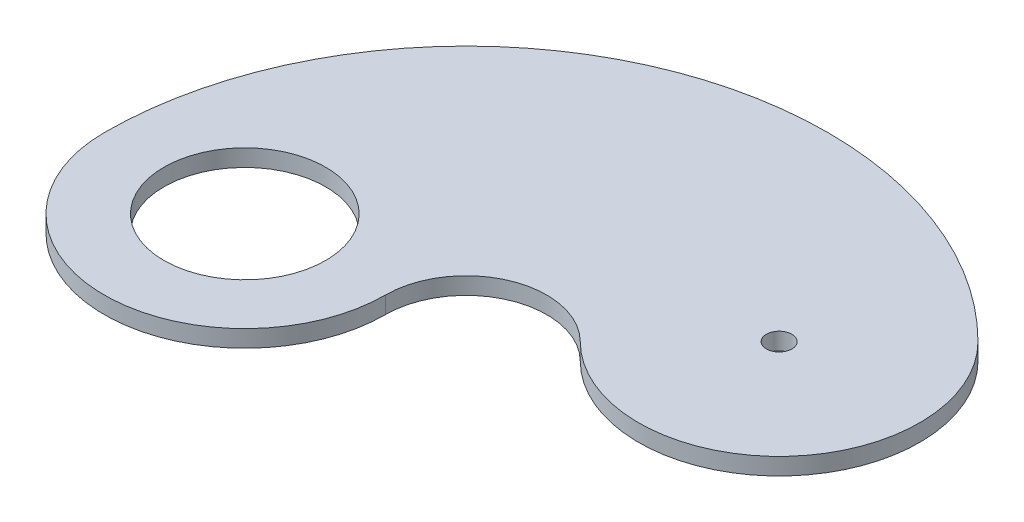
ISO-10303-21;
HEADER;
FILE_DESCRIPTION(('STEP AP214'),'2;1');
FILE_NAME('part.step','',(''),(''),'','','');
FILE_SCHEMA(('AUTOMOTIVE_DESIGN { 1 0 10303 214 1 1 1 1 }'));
ENDSEC;
DATA;
#1=APPLICATION_CONTEXT('core data for automotive mechanical design processes');
#2=APPLICATION_PROTOCOL_DEFINITION('international standard','automotive_design',2000,#1);
#3=PRODUCT_CONTEXT('',#1,'mechanical');
#4=PRODUCT('Part','Part','',(#3));
#5=PRODUCT_RELATED_PRODUCT_CATEGORY('part','',(#4));
#6=PRODUCT_DEFINITION_FORMATION('','',#4);
#7=PRODUCT_DEFINITION_CONTEXT('part definition',#1,'design');
#8=PRODUCT_DEFINITION('design','',#6,#7);
#9=PRODUCT_DEFINITION_SHAPE('','',#8);
#10=(LENGTH_UNIT() NAMED_UNIT(*) SI_UNIT(.MILLI.,.METRE.));
#11=(NAMED_UNIT(*) PLANE_ANGLE_UNIT() SI_UNIT($,.RADIAN.));
#12=(NAMED_UNIT(*) SI_UNIT($,.STERADIAN.) SOLID_ANGLE_UNIT());
#13=UNCERTAINTY_MEASURE_WITH_UNIT(LENGTH_MEASURE(1.E-05),#10,'distance_accuracy_value','');
#14=(GEOMETRIC_REPRESENTATION_CONTEXT(3) GLOBAL_UNCERTAINTY_ASSIGNED_CONTEXT((#13)) GLOBAL_UNIT_ASSIGNED_CONTEXT((#10,
#11,#12)) REPRESENTATION_CONTEXT('',''));
#15=CARTESIAN_POINT('',(0.,0.,0.));
#16=DIRECTION('',(0.,0.,1.));
#17=DIRECTION('',(1.,0.,0.));
#18=AXIS2_PLACEMENT_3D('',#15,#16,#17);
#19=CARTESIAN_POINT('',(0.,6.35,0.));
#20=DIRECTION('',(0.,-1.,0.));
#21=DIRECTION('',(0.,0.,-1.));
#22=AXIS2_PLACEMENT_3D('',#19,#20,#21);
#23=CYLINDRICAL_SURFACE('',#22,135.);
#24=DIRECTION('',(0.,1.,0.));
#25=VECTOR('',#24,1.);
#26=CARTESIAN_POINT('',(95.4594154601841,0.,-95.4594154601838));
#27=LINE('',#26,#25);
#28=CARTESIAN_POINT('',(95.4594154601841,0.,-95.4594154601838));
#29=VERTEX_POINT('',#28);
#30=CARTESIAN_POINT('',(95.4594154601841,6.35,-95.4594154601838));
#31=VERTEX_POINT('',#30);
#32=EDGE_CURVE('E89',#29,#31,#27,.T.);
#33=ORIENTED_EDGE('',*,*,#32,.F.);
#34=CARTESIAN_POINT('',(0.,0.,0.));
#35=DIRECTION('',(0.,1.,0.));
#36=DIRECTION('',(0.,0.,1.));
#37=AXIS2_PLACEMENT_3D('',#34,#35,#36);
#38=CIRCLE('',#37,135.);
#39=CARTESIAN_POINT('',(-135.,0.,0.));
#40=VERTEX_POINT('',#39);
#41=EDGE_CURVE('E52',#29,#40,#38,.T.);
#42=ORIENTED_EDGE('',*,*,#41,.T.);
#43=DIRECTION('',(0.,1.,0.));
#44=VECTOR('',#43,1.);
#45=CARTESIAN_POINT('',(-135.,0.,0.));
#46=LINE('',#45,#44);
#47=CARTESIAN_POINT('',(-135.,6.35,0.));
#48=VERTEX_POINT('',#47);
#49=EDGE_CURVE('E120',#40,#48,#46,.T.);
#50=ORIENTED_EDGE('',*,*,#49,.T.);
#51=CARTESIAN_POINT('',(0.,6.35,0.));
#52=DIRECTION('',(0.,1.,0.));
#53=DIRECTION('',(0.,0.,1.));
#54=AXIS2_PLACEMENT_3D('',#51,#52,#53);
#55=CIRCLE('',#54,135.);
#56=EDGE_CURVE('E12',#31,#48,#55,.T.);
#57=ORIENTED_EDGE('',*,*,#56,.F.);
#58=EDGE_LOOP('',(#33,#42,#50,#57));
#59=FACE_BOUND('',#58,.T.);
#60=ADVANCED_FACE('F49',(#59),#23,.T.);
#61=CARTESIAN_POINT('',(0.,6.35,0.));
#62=DIRECTION('',(0.,1.,0.));
#63=DIRECTION('',(0.,0.,1.));
#64=AXIS2_PLACEMENT_3D('',#61,#62,#63);
#65=PLANE('',#64);
#66=CARTESIAN_POINT('',(58.3716647869496,6.35,-58.3716647869494));
#67=DIRECTION('',(0.,1.,0.));
#68=DIRECTION('',(0.,0.,1.));
#69=AXIS2_PLACEMENT_3D('',#66,#67,#68);
#70=CIRCLE('',#69,4.76249999999999);
#71=CARTESIAN_POINT('',(58.3716647869496,6.35,-53.6091647869494));
#72=VERTEX_POINT('',#71);
#73=EDGE_CURVE('E162',#72,#72,#70,.T.);
#74=ORIENTED_EDGE('',*,*,#73,.F.);
#75=EDGE_LOOP('',(#74));
#76=FACE_BOUND('',#75,.T.);
#77=CARTESIAN_POINT('',(-82.55,6.35,0.));
#78=DIRECTION('',(0.,1.,0.));
#79=DIRECTION('',(0.,0.,1.));
#80=AXIS2_PLACEMENT_3D('',#77,#78,#79);
#81=CIRCLE('',#80,30.1625);
#82=CARTESIAN_POINT('',(-82.55,6.35,30.1625));
#83=VERTEX_POINT('',#82);
#84=EDGE_CURVE('E112',#83,#83,#81,.T.);
#85=ORIENTED_EDGE('',*,*,#84,.F.);
#86=EDGE_LOOP('',(#85));
#87=FACE_BOUND('',#86,.T.);
#88=CARTESIAN_POINT('',(0.,6.35,0.));
#89=DIRECTION('',(0.,1.,0.));
#90=DIRECTION('',(0.,0.,1.));
#91=AXIS2_PLACEMENT_3D('',#88,#89,#90);
#92=CIRCLE('',#91,30.1);
#93=CARTESIAN_POINT('',(21.2839141137151,6.35,-21.2839141137151));
#94=VERTEX_POINT('',#93);
#95=CARTESIAN_POINT('',(-30.1,6.35,0.));
#96=VERTEX_POINT('',#95);
#97=EDGE_CURVE('E109',#94,#96,#92,.T.);
#98=ORIENTED_EDGE('',*,*,#97,.F.);
#99=CARTESIAN_POINT('',(58.3716647869495,6.35,-58.3716647869495));
#100=DIRECTION('',(0.,1.,0.));
#101=DIRECTION('',(0.,0.,1.));
#102=AXIS2_PLACEMENT_3D('',#99,#100,#101);
#103=CIRCLE('',#102,52.45);
#104=EDGE_CURVE('E93',#94,#31,#103,.T.);
#105=ORIENTED_EDGE('',*,*,#104,.T.);
#106=ORIENTED_EDGE('',*,*,#56,.T.);
#107=CARTESIAN_POINT('',(-82.55,6.35,0.));
#108=DIRECTION('',(0.,1.,0.));
#109=DIRECTION('',(0.,0.,1.));
#110=AXIS2_PLACEMENT_3D('',#107,#108,#109);
#111=CIRCLE('',#110,52.45);
#112=EDGE_CURVE('E106',#48,#96,#111,.T.);
#113=ORIENTED_EDGE('',*,*,#112,.T.);
#114=EDGE_LOOP('',(#98,#105,#106,#113));
#115=FACE_BOUND('',#114,.T.);
#116=ADVANCED_FACE('F126',(#76,#87,#115),#65,.T.);
#117=CARTESIAN_POINT('',(0.,0.,0.));
#118=DIRECTION('',(0.,1.,0.));
#119=DIRECTION('',(0.,0.,1.));
#120=AXIS2_PLACEMENT_3D('',#117,#118,#119);
#121=PLANE('',#120);
#122=CARTESIAN_POINT('',(58.3716647869496,0.,-58.3716647869494));
#123=DIRECTION('',(0.,1.,0.));
#124=DIRECTION('',(0.,0.,1.));
#125=AXIS2_PLACEMENT_3D('',#122,#123,#124);
#126=CIRCLE('',#125,4.76249999999999);
#127=CARTESIAN_POINT('',(58.3716647869496,0.,-53.6091647869494));
#128=VERTEX_POINT('',#127);
#129=EDGE_CURVE('E160',#128,#128,#126,.T.);
#130=ORIENTED_EDGE('',*,*,#129,.T.);
#131=EDGE_LOOP('',(#130));
#132=FACE_BOUND('',#131,.T.);
#133=CARTESIAN_POINT('',(-82.55,0.,0.));
#134=DIRECTION('',(0.,1.,0.));
#135=DIRECTION('',(0.,0.,1.));
#136=AXIS2_PLACEMENT_3D('',#133,#134,#135);
#137=CIRCLE('',#136,30.1625);
#138=CARTESIAN_POINT('',(-82.55,0.,30.1625));
#139=VERTEX_POINT('',#138);
#140=EDGE_CURVE('E117',#139,#139,#137,.T.);
#141=ORIENTED_EDGE('',*,*,#140,.T.);
#142=EDGE_LOOP('',(#141));
#143=FACE_BOUND('',#142,.T.);
#144=CARTESIAN_POINT('',(58.3716647869495,0.,-58.3716647869495));
#145=DIRECTION('',(0.,1.,0.));
#146=DIRECTION('',(0.,0.,1.));
#147=AXIS2_PLACEMENT_3D('',#144,#145,#146);
#148=CIRCLE('',#147,52.45);
#149=CARTESIAN_POINT('',(21.2839141137151,0.,-21.2839141137151));
#150=VERTEX_POINT('',#149);
#151=EDGE_CURVE('E73',#150,#29,#148,.T.);
#152=ORIENTED_EDGE('',*,*,#151,.F.);
#153=CARTESIAN_POINT('',(0.,0.,0.));
#154=DIRECTION('',(0.,1.,0.));
#155=DIRECTION('',(0.,0.,1.));
#156=AXIS2_PLACEMENT_3D('',#153,#154,#155);
#157=CIRCLE('',#156,30.1);
#158=CARTESIAN_POINT('',(-30.1,0.,0.));
#159=VERTEX_POINT('',#158);
#160=EDGE_CURVE('E98',#150,#159,#157,.T.);
#161=ORIENTED_EDGE('',*,*,#160,.T.);
#162=CARTESIAN_POINT('',(-82.55,0.,0.));
#163=DIRECTION('',(0.,1.,0.));
#164=DIRECTION('',(0.,0.,1.));
#165=AXIS2_PLACEMENT_3D('',#162,#163,#164);
#166=CIRCLE('',#165,52.45);
#167=EDGE_CURVE('E95',#40,#159,#166,.T.);
#168=ORIENTED_EDGE('',*,*,#167,.F.);
#169=ORIENTED_EDGE('',*,*,#41,.F.);
#170=EDGE_LOOP('',(#152,#161,#168,#169));
#171=FACE_BOUND('',#170,.T.);
#172=ADVANCED_FACE('F104',(#132,#143,#171),#121,.F.);
#173=CARTESIAN_POINT('',(58.3716647869495,0.,-58.3716647869495));
#174=DIRECTION('',(0.,1.,0.));
#175=DIRECTION('',(0.,0.,1.));
#176=AXIS2_PLACEMENT_3D('',#173,#174,#175);
#177=CYLINDRICAL_SURFACE('',#176,52.45);
#178=ORIENTED_EDGE('',*,*,#104,.F.);
#179=DIRECTION('',(0.,1.,0.));
#180=VECTOR('',#179,1.);
#181=CARTESIAN_POINT('',(21.2839141137151,0.,-21.2839141137151));
#182=LINE('',#181,#180);
#183=EDGE_CURVE('E91',#150,#94,#182,.T.);
#184=ORIENTED_EDGE('',*,*,#183,.F.);
#185=ORIENTED_EDGE('',*,*,#151,.T.);
#186=ORIENTED_EDGE('',*,*,#32,.T.);
#187=EDGE_LOOP('',(#178,#184,#185,#186));
#188=FACE_BOUND('',#187,.T.);
#189=ADVANCED_FACE('F92',(#188),#177,.T.);
#190=CARTESIAN_POINT('',(-82.55,0.,0.));
#191=DIRECTION('',(0.,1.,0.));
#192=DIRECTION('',(0.,0.,1.));
#193=AXIS2_PLACEMENT_3D('',#190,#191,#192);
#194=CYLINDRICAL_SURFACE('',#193,52.45);
#195=ORIENTED_EDGE('',*,*,#112,.F.);
#196=ORIENTED_EDGE('',*,*,#49,.F.);
#197=ORIENTED_EDGE('',*,*,#167,.T.);
#198=DIRECTION('',(0.,1.,0.));
#199=VECTOR('',#198,1.);
#200=CARTESIAN_POINT('',(-30.1,0.,0.));
#201=LINE('',#200,#199);
#202=EDGE_CURVE('E64',#159,#96,#201,.T.);
#203=ORIENTED_EDGE('',*,*,#202,.T.);
#204=EDGE_LOOP('',(#195,#196,#197,#203));
#205=FACE_BOUND('',#204,.T.);
#206=ADVANCED_FACE('F124',(#205),#194,.T.);
#207=CARTESIAN_POINT('',(0.,0.,0.));
#208=DIRECTION('',(0.,1.,0.));
#209=DIRECTION('',(0.,0.,1.));
#210=AXIS2_PLACEMENT_3D('',#207,#208,#209);
#211=CYLINDRICAL_SURFACE('',#210,30.1);
#212=ORIENTED_EDGE('',*,*,#97,.T.);
#213=ORIENTED_EDGE('',*,*,#202,.F.);
#214=ORIENTED_EDGE('',*,*,#160,.F.);
#215=ORIENTED_EDGE('',*,*,#183,.T.);
#216=EDGE_LOOP('',(#212,#213,#214,#215));
#217=FACE_BOUND('',#216,.T.);
#218=ADVANCED_FACE('F99',(#217),#211,.F.);
#219=CARTESIAN_POINT('',(-82.55,0.,0.));
#220=DIRECTION('',(0.,1.,0.));
#221=DIRECTION('',(0.,0.,1.));
#222=AXIS2_PLACEMENT_3D('',#219,#220,#221);
#223=CYLINDRICAL_SURFACE('',#222,30.1625);
#224=ORIENTED_EDGE('',*,*,#140,.F.);
#225=EDGE_LOOP('',(#224));
#226=FACE_BOUND('',#225,.T.);
#227=ORIENTED_EDGE('',*,*,#84,.T.);
#228=EDGE_LOOP('',(#227));
#229=FACE_BOUND('',#228,.T.);
#230=ADVANCED_FACE('F146',(#226,#229),#223,.F.);
#231=CARTESIAN_POINT('',(58.3716647869496,0.,-58.3716647869494));
#232=DIRECTION('',(0.,1.,0.));
#233=DIRECTION('',(0.,0.,1.));
#234=AXIS2_PLACEMENT_3D('',#231,#232,#233);
#235=CYLINDRICAL_SURFACE('',#234,4.76249999999999);
#236=ORIENTED_EDGE('',*,*,#129,.F.);
#237=EDGE_LOOP('',(#236));
#238=FACE_BOUND('',#237,.T.);
#239=ORIENTED_EDGE('',*,*,#73,.T.);
#240=EDGE_LOOP('',(#239));
#241=FACE_BOUND('',#240,.T.);
#242=ADVANCED_FACE('F151',(#238,#241),#235,.F.);
#243=CLOSED_SHELL('',(#60,#116,#172,#189,#206,#218,#230,#242));
#244=MANIFOLD_SOLID_BREP('B2',#243);
#245=ADVANCED_BREP_SHAPE_REPRESENTATION('',(#18,#244),#14);
#246=SHAPE_DEFINITION_REPRESENTATION(#9,#245);
ENDSEC;
END-ISO-10303-21;
